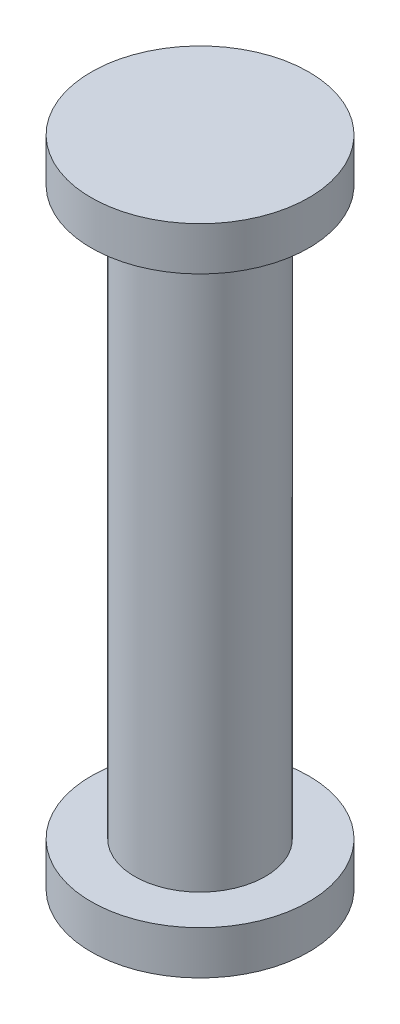
ISO-10303-21;
HEADER;
FILE_DESCRIPTION(('STEP AP214'),'2;1');
FILE_NAME('part.step','',(''),(''),'','','');
FILE_SCHEMA(('AUTOMOTIVE_DESIGN { 1 0 10303 214 1 1 1 1 }'));
ENDSEC;
DATA;
#1=APPLICATION_CONTEXT('core data for automotive mechanical design processes');
#2=APPLICATION_PROTOCOL_DEFINITION('international standard','automotive_design',2000,#1);
#3=PRODUCT_CONTEXT('',#1,'mechanical');
#4=PRODUCT('Part','Part','',(#3));
#5=PRODUCT_RELATED_PRODUCT_CATEGORY('part','',(#4));
#6=PRODUCT_DEFINITION_FORMATION('','',#4);
#7=PRODUCT_DEFINITION_CONTEXT('part definition',#1,'design');
#8=PRODUCT_DEFINITION('design','',#6,#7);
#9=PRODUCT_DEFINITION_SHAPE('','',#8);
#10=(LENGTH_UNIT() NAMED_UNIT(*) SI_UNIT(.MILLI.,.METRE.));
#11=(NAMED_UNIT(*) PLANE_ANGLE_UNIT() SI_UNIT($,.RADIAN.));
#12=(NAMED_UNIT(*) SI_UNIT($,.STERADIAN.) SOLID_ANGLE_UNIT());
#13=UNCERTAINTY_MEASURE_WITH_UNIT(LENGTH_MEASURE(1.E-05),#10,'distance_accuracy_value','');
#14=(GEOMETRIC_REPRESENTATION_CONTEXT(3) GLOBAL_UNCERTAINTY_ASSIGNED_CONTEXT((#13)) GLOBAL_UNIT_ASSIGNED_CONTEXT((#10,
#11,#12)) REPRESENTATION_CONTEXT('',''));
#15=CARTESIAN_POINT('',(0.,0.,0.));
#16=DIRECTION('',(0.,0.,1.));
#17=DIRECTION('',(1.,0.,0.));
#18=AXIS2_PLACEMENT_3D('',#15,#16,#17);
#19=CARTESIAN_POINT('',(-2.5,0.,0.));
#20=DIRECTION('',(0.,1.,0.));
#21=DIRECTION('',(0.,0.,1.));
#22=AXIS2_PLACEMENT_3D('',#19,#20,#21);
#23=PLANE('',#22);
#24=CARTESIAN_POINT('',(0.,0.,0.));
#25=DIRECTION('',(0.,-1.,0.));
#26=DIRECTION('',(0.,0.,-1.));
#27=AXIS2_PLACEMENT_3D('',#24,#25,#26);
#28=CIRCLE('',#27,2.5);
#29=CARTESIAN_POINT('',(0.,0.,-2.5));
#30=VERTEX_POINT('',#29);
#31=EDGE_CURVE('E66',#30,#30,#28,.T.);
#32=ORIENTED_EDGE('',*,*,#31,.T.);
#33=EDGE_LOOP('',(#32));
#34=FACE_BOUND('',#33,.T.);
#35=ADVANCED_FACE('F39',(#34),#23,.F.);
#36=CARTESIAN_POINT('',(0.,15.,0.));
#37=DIRECTION('',(0.,-1.,0.));
#38=DIRECTION('',(0.,0.,-1.));
#39=AXIS2_PLACEMENT_3D('',#36,#37,#38);
#40=PLANE('',#39);
#41=CARTESIAN_POINT('',(0.,15.,0.));
#42=DIRECTION('',(0.,-1.,0.));
#43=DIRECTION('',(0.,0.,-1.));
#44=AXIS2_PLACEMENT_3D('',#41,#42,#43);
#45=CIRCLE('',#44,2.5);
#46=CARTESIAN_POINT('',(0.,15.,-2.5));
#47=VERTEX_POINT('',#46);
#48=EDGE_CURVE('E10',#47,#47,#45,.T.);
#49=ORIENTED_EDGE('',*,*,#48,.F.);
#50=EDGE_LOOP('',(#49));
#51=FACE_BOUND('',#50,.T.);
#52=ADVANCED_FACE('F97',(#51),#40,.F.);
#53=CARTESIAN_POINT('',(0.,0.,0.));
#54=DIRECTION('',(0.,-1.,0.));
#55=DIRECTION('',(0.,0.,-1.));
#56=AXIS2_PLACEMENT_3D('',#53,#54,#55);
#57=CYLINDRICAL_SURFACE('',#56,2.5);
#58=CARTESIAN_POINT('',(0.,14.,0.));
#59=DIRECTION('',(0.,-1.,0.));
#60=DIRECTION('',(0.,0.,-1.));
#61=AXIS2_PLACEMENT_3D('',#58,#59,#60);
#62=CIRCLE('',#61,2.5);
#63=CARTESIAN_POINT('',(0.,14.,-2.5));
#64=VERTEX_POINT('',#63);
#65=EDGE_CURVE('E46',#64,#64,#62,.T.);
#66=ORIENTED_EDGE('',*,*,#65,.F.);
#67=EDGE_LOOP('',(#66));
#68=FACE_BOUND('',#67,.T.);
#69=ORIENTED_EDGE('',*,*,#48,.T.);
#70=EDGE_LOOP('',(#69));
#71=FACE_BOUND('',#70,.T.);
#72=ADVANCED_FACE('F92',(#68,#71),#57,.T.);
#73=CARTESIAN_POINT('',(-2.5,14.,0.));
#74=DIRECTION('',(0.,1.,0.));
#75=DIRECTION('',(0.,0.,1.));
#76=AXIS2_PLACEMENT_3D('',#73,#74,#75);
#77=PLANE('',#76);
#78=CARTESIAN_POINT('',(0.,14.,0.));
#79=DIRECTION('',(0.,-1.,0.));
#80=DIRECTION('',(0.,0.,-1.));
#81=AXIS2_PLACEMENT_3D('',#78,#79,#80);
#82=CIRCLE('',#81,1.5);
#83=CARTESIAN_POINT('',(0.,14.,-1.5));
#84=VERTEX_POINT('',#83);
#85=EDGE_CURVE('E51',#84,#84,#82,.T.);
#86=ORIENTED_EDGE('',*,*,#85,.F.);
#87=EDGE_LOOP('',(#86));
#88=FACE_BOUND('',#87,.T.);
#89=ORIENTED_EDGE('',*,*,#65,.T.);
#90=EDGE_LOOP('',(#89));
#91=FACE_BOUND('',#90,.T.);
#92=ADVANCED_FACE('F87',(#88,#91),#77,.F.);
#93=CARTESIAN_POINT('',(0.,0.,0.));
#94=DIRECTION('',(0.,-1.,0.));
#95=DIRECTION('',(0.,0.,-1.));
#96=AXIS2_PLACEMENT_3D('',#93,#94,#95);
#97=CYLINDRICAL_SURFACE('',#96,1.5);
#98=CARTESIAN_POINT('',(0.,1.,0.));
#99=DIRECTION('',(0.,-1.,0.));
#100=DIRECTION('',(0.,0.,-1.));
#101=AXIS2_PLACEMENT_3D('',#98,#99,#100);
#102=CIRCLE('',#101,1.5);
#103=CARTESIAN_POINT('',(0.,1.,-1.5));
#104=VERTEX_POINT('',#103);
#105=EDGE_CURVE('E56',#104,#104,#102,.T.);
#106=ORIENTED_EDGE('',*,*,#105,.F.);
#107=EDGE_LOOP('',(#106));
#108=FACE_BOUND('',#107,.T.);
#109=ORIENTED_EDGE('',*,*,#85,.T.);
#110=EDGE_LOOP('',(#109));
#111=FACE_BOUND('',#110,.T.);
#112=ADVANCED_FACE('F81',(#108,#111),#97,.T.);
#113=CARTESIAN_POINT('',(-1.5,1.,0.));
#114=DIRECTION('',(0.,-1.,0.));
#115=DIRECTION('',(0.,0.,-1.));
#116=AXIS2_PLACEMENT_3D('',#113,#114,#115);
#117=PLANE('',#116);
#118=CARTESIAN_POINT('',(0.,1.,0.));
#119=DIRECTION('',(0.,-1.,0.));
#120=DIRECTION('',(0.,0.,-1.));
#121=AXIS2_PLACEMENT_3D('',#118,#119,#120);
#122=CIRCLE('',#121,2.5);
#123=CARTESIAN_POINT('',(0.,1.,-2.5));
#124=VERTEX_POINT('',#123);
#125=EDGE_CURVE('E62',#124,#124,#122,.T.);
#126=ORIENTED_EDGE('',*,*,#125,.F.);
#127=EDGE_LOOP('',(#126));
#128=FACE_BOUND('',#127,.T.);
#129=ORIENTED_EDGE('',*,*,#105,.T.);
#130=EDGE_LOOP('',(#129));
#131=FACE_BOUND('',#130,.T.);
#132=ADVANCED_FACE('F75',(#128,#131),#117,.F.);
#133=CARTESIAN_POINT('',(0.,0.,0.));
#134=DIRECTION('',(0.,-1.,0.));
#135=DIRECTION('',(0.,0.,-1.));
#136=AXIS2_PLACEMENT_3D('',#133,#134,#135);
#137=CYLINDRICAL_SURFACE('',#136,2.5);
#138=ORIENTED_EDGE('',*,*,#31,.F.);
#139=EDGE_LOOP('',(#138));
#140=FACE_BOUND('',#139,.T.);
#141=ORIENTED_EDGE('',*,*,#125,.T.);
#142=EDGE_LOOP('',(#141));
#143=FACE_BOUND('',#142,.T.);
#144=ADVANCED_FACE('F72',(#140,#143),#137,.T.);
#145=CLOSED_SHELL('',(#35,#52,#72,#92,#112,#132,#144));
#146=MANIFOLD_SOLID_BREP('B2',#145);
#147=ADVANCED_BREP_SHAPE_REPRESENTATION('',(#18,#146),#14);
#148=SHAPE_DEFINITION_REPRESENTATION(#9,#147);
ENDSEC;
END-ISO-10303-21;
